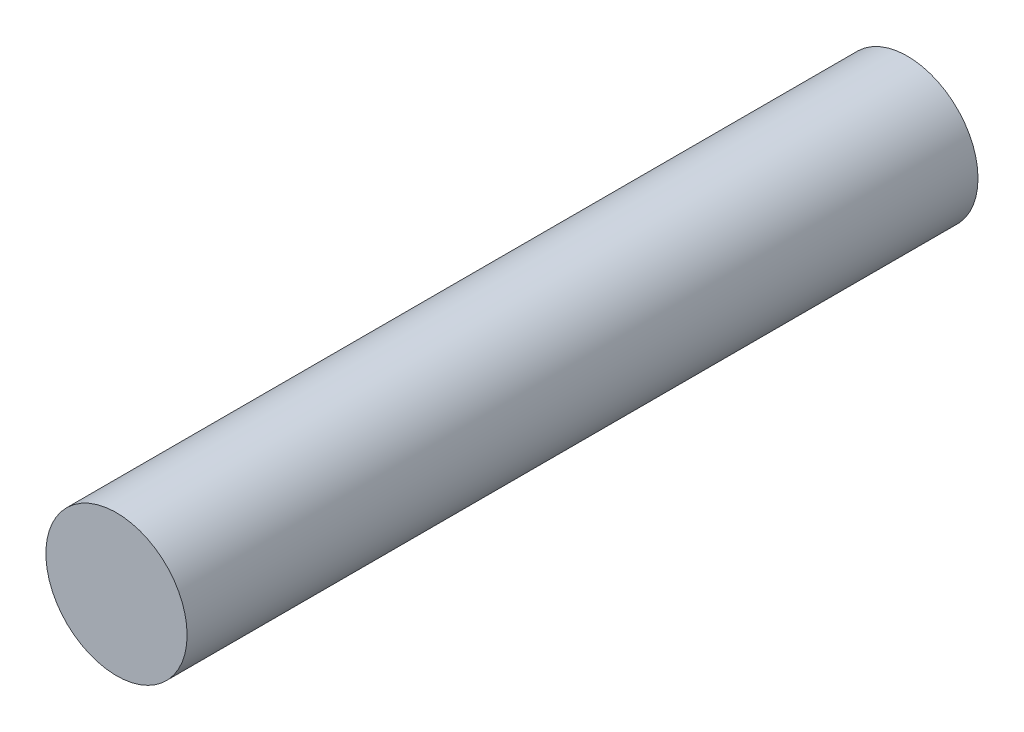
ISO-10303-21;
HEADER;
FILE_DESCRIPTION(('STEP AP214'),'2;1');
FILE_NAME('part.step','',(''),(''),'','','');
FILE_SCHEMA(('AUTOMOTIVE_DESIGN { 1 0 10303 214 1 1 1 1 }'));
ENDSEC;
DATA;
#1=APPLICATION_CONTEXT('core data for automotive mechanical design processes');
#2=APPLICATION_PROTOCOL_DEFINITION('international standard','automotive_design',2000,#1);
#3=PRODUCT_CONTEXT('',#1,'mechanical');
#4=PRODUCT('Part','Part','',(#3));
#5=PRODUCT_RELATED_PRODUCT_CATEGORY('part','',(#4));
#6=PRODUCT_DEFINITION_FORMATION('','',#4);
#7=PRODUCT_DEFINITION_CONTEXT('part definition',#1,'design');
#8=PRODUCT_DEFINITION('design','',#6,#7);
#9=PRODUCT_DEFINITION_SHAPE('','',#8);
#10=(LENGTH_UNIT() NAMED_UNIT(*) SI_UNIT(.MILLI.,.METRE.));
#11=(NAMED_UNIT(*) PLANE_ANGLE_UNIT() SI_UNIT($,.RADIAN.));
#12=(NAMED_UNIT(*) SI_UNIT($,.STERADIAN.) SOLID_ANGLE_UNIT());
#13=UNCERTAINTY_MEASURE_WITH_UNIT(LENGTH_MEASURE(1.E-05),#10,'distance_accuracy_value','');
#14=(GEOMETRIC_REPRESENTATION_CONTEXT(3) GLOBAL_UNCERTAINTY_ASSIGNED_CONTEXT((#13)) GLOBAL_UNIT_ASSIGNED_CONTEXT((#10,
#11,#12)) REPRESENTATION_CONTEXT('',''));
#15=CARTESIAN_POINT('',(0.,0.,0.));
#16=DIRECTION('',(0.,0.,1.));
#17=DIRECTION('',(1.,0.,0.));
#18=AXIS2_PLACEMENT_3D('',#15,#16,#17);
#19=CARTESIAN_POINT('',(0.,0.,28.));
#20=DIRECTION('',(0.,0.,-1.));
#21=DIRECTION('',(-1.,0.,0.));
#22=AXIS2_PLACEMENT_3D('',#19,#20,#21);
#23=CYLINDRICAL_SURFACE('',#22,2.5);
#24=CARTESIAN_POINT('',(0.,0.,28.));
#25=DIRECTION('',(0.,0.,1.));
#26=DIRECTION('',(1.,0.,0.));
#27=AXIS2_PLACEMENT_3D('',#24,#25,#26);
#28=CIRCLE('',#27,2.5);
#29=CARTESIAN_POINT('',(2.5,0.,28.));
#30=VERTEX_POINT('',#29);
#31=EDGE_CURVE('E10',#30,#30,#28,.T.);
#32=ORIENTED_EDGE('',*,*,#31,.F.);
#33=EDGE_LOOP('',(#32));
#34=FACE_BOUND('',#33,.T.);
#35=CARTESIAN_POINT('',(0.,0.,0.));
#36=DIRECTION('',(0.,0.,1.));
#37=DIRECTION('',(1.,0.,0.));
#38=AXIS2_PLACEMENT_3D('',#35,#36,#37);
#39=CIRCLE('',#38,2.5);
#40=CARTESIAN_POINT('',(2.5,0.,0.));
#41=VERTEX_POINT('',#40);
#42=EDGE_CURVE('E40',#41,#41,#39,.T.);
#43=ORIENTED_EDGE('',*,*,#42,.T.);
#44=EDGE_LOOP('',(#43));
#45=FACE_BOUND('',#44,.T.);
#46=ADVANCED_FACE('F37',(#34,#45),#23,.T.);
#47=CARTESIAN_POINT('',(0.,0.,28.));
#48=DIRECTION('',(0.,0.,1.));
#49=DIRECTION('',(1.,0.,0.));
#50=AXIS2_PLACEMENT_3D('',#47,#48,#49);
#51=PLANE('',#50);
#52=ORIENTED_EDGE('',*,*,#31,.T.);
#53=EDGE_LOOP('',(#52));
#54=FACE_BOUND('',#53,.T.);
#55=ADVANCED_FACE('F52',(#54),#51,.T.);
#56=CARTESIAN_POINT('',(0.,0.,0.));
#57=DIRECTION('',(0.,0.,1.));
#58=DIRECTION('',(1.,0.,0.));
#59=AXIS2_PLACEMENT_3D('',#56,#57,#58);
#60=PLANE('',#59);
#61=ORIENTED_EDGE('',*,*,#42,.F.);
#62=EDGE_LOOP('',(#61));
#63=FACE_BOUND('',#62,.T.);
#64=ADVANCED_FACE('F50',(#63),#60,.F.);
#65=CLOSED_SHELL('',(#46,#55,#64));
#66=MANIFOLD_SOLID_BREP('B2',#65);
#67=ADVANCED_BREP_SHAPE_REPRESENTATION('',(#18,#66),#14);
#68=SHAPE_DEFINITION_REPRESENTATION(#9,#67);
ENDSEC;
END-ISO-10303-21;
